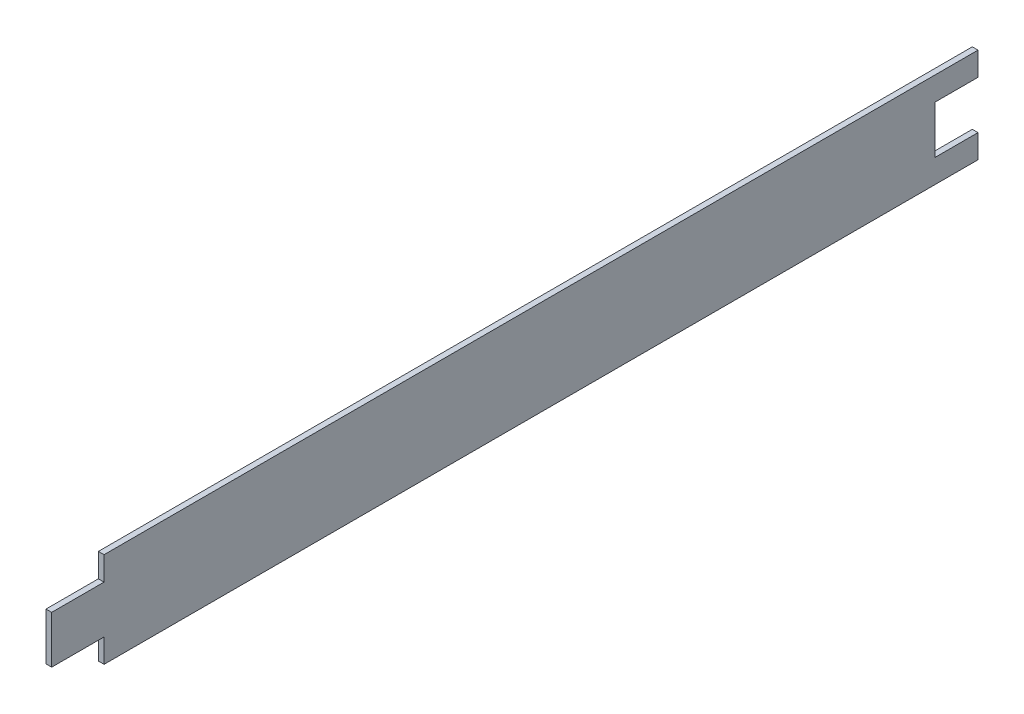
ISO-10303-21;
HEADER;
FILE_DESCRIPTION(('STEP AP214'),'2;1');
FILE_NAME('part.step','',(''),(''),'','','');
FILE_SCHEMA(('AUTOMOTIVE_DESIGN { 1 0 10303 214 1 1 1 1 }'));
ENDSEC;
DATA;
#1=APPLICATION_CONTEXT('core data for automotive mechanical design processes');
#2=APPLICATION_PROTOCOL_DEFINITION('international standard','automotive_design',2000,#1);
#3=PRODUCT_CONTEXT('',#1,'mechanical');
#4=PRODUCT('Part','Part','',(#3));
#5=PRODUCT_RELATED_PRODUCT_CATEGORY('part','',(#4));
#6=PRODUCT_DEFINITION_FORMATION('','',#4);
#7=PRODUCT_DEFINITION_CONTEXT('part definition',#1,'design');
#8=PRODUCT_DEFINITION('design','',#6,#7);
#9=PRODUCT_DEFINITION_SHAPE('','',#8);
#10=(LENGTH_UNIT() NAMED_UNIT(*) SI_UNIT(.MILLI.,.METRE.));
#11=(NAMED_UNIT(*) PLANE_ANGLE_UNIT() SI_UNIT($,.RADIAN.));
#12=(NAMED_UNIT(*) SI_UNIT($,.STERADIAN.) SOLID_ANGLE_UNIT());
#13=UNCERTAINTY_MEASURE_WITH_UNIT(LENGTH_MEASURE(1.E-05),#10,'distance_accuracy_value','');
#14=(GEOMETRIC_REPRESENTATION_CONTEXT(3) GLOBAL_UNCERTAINTY_ASSIGNED_CONTEXT((#13)) GLOBAL_UNIT_ASSIGNED_CONTEXT((#10,
#11,#12)) REPRESENTATION_CONTEXT('',''));
#15=CARTESIAN_POINT('',(0.,0.,0.));
#16=DIRECTION('',(0.,0.,1.));
#17=DIRECTION('',(1.,0.,0.));
#18=AXIS2_PLACEMENT_3D('',#15,#16,#17);
#19=CARTESIAN_POINT('',(3.,12.5,0.));
#20=DIRECTION('',(0.,1.,0.));
#21=DIRECTION('',(0.,0.,1.));
#22=AXIS2_PLACEMENT_3D('',#19,#20,#21);
#23=PLANE('',#22);
#24=DIRECTION('',(0.,0.,-1.));
#25=VECTOR('',#24,1.);
#26=CARTESIAN_POINT('',(0.,12.5,0.));
#27=LINE('',#26,#25);
#28=CARTESIAN_POINT('',(0.,12.5,257.569429710444));
#29=VERTEX_POINT('',#28);
#30=CARTESIAN_POINT('',(0.,12.5,230.));
#31=VERTEX_POINT('',#30);
#32=EDGE_CURVE('E155',#29,#31,#27,.T.);
#33=ORIENTED_EDGE('',*,*,#32,.F.);
#34=DIRECTION('',(-1.,0.,0.));
#35=VECTOR('',#34,1.);
#36=CARTESIAN_POINT('',(3.,12.5,257.569429710444));
#37=LINE('',#36,#35);
#38=CARTESIAN_POINT('',(3.,12.5,257.569429710444));
#39=VERTEX_POINT('',#38);
#40=EDGE_CURVE('E11',#39,#29,#37,.T.);
#41=ORIENTED_EDGE('',*,*,#40,.F.);
#42=DIRECTION('',(0.,0.,-1.));
#43=VECTOR('',#42,1.);
#44=CARTESIAN_POINT('',(3.,12.5,0.));
#45=LINE('',#44,#43);
#46=CARTESIAN_POINT('',(3.,12.5,230.));
#47=VERTEX_POINT('',#46);
#48=EDGE_CURVE('E215',#39,#47,#45,.T.);
#49=ORIENTED_EDGE('',*,*,#48,.T.);
#50=DIRECTION('',(-1.,0.,0.));
#51=VECTOR('',#50,1.);
#52=CARTESIAN_POINT('',(3.,12.5,230.));
#53=LINE('',#52,#51);
#54=EDGE_CURVE('E97',#47,#31,#53,.T.);
#55=ORIENTED_EDGE('',*,*,#54,.T.);
#56=EDGE_LOOP('',(#33,#41,#49,#55));
#57=FACE_BOUND('',#56,.T.);
#58=ADVANCED_FACE('F35',(#57),#23,.T.);
#59=CARTESIAN_POINT('',(3.,0.,257.569429710444));
#60=DIRECTION('',(0.,0.,1.));
#61=DIRECTION('',(1.,0.,0.));
#62=AXIS2_PLACEMENT_3D('',#59,#60,#61);
#63=PLANE('',#62);
#64=DIRECTION('',(0.,1.,0.));
#65=VECTOR('',#64,1.);
#66=CARTESIAN_POINT('',(0.,0.,257.569429710444));
#67=LINE('',#66,#65);
#68=CARTESIAN_POINT('',(0.,-12.5,257.569429710444));
#69=VERTEX_POINT('',#68);
#70=EDGE_CURVE('E158',#69,#29,#67,.T.);
#71=ORIENTED_EDGE('',*,*,#70,.F.);
#72=DIRECTION('',(-1.,0.,0.));
#73=VECTOR('',#72,1.);
#74=CARTESIAN_POINT('',(3.,-12.5,257.569429710444));
#75=LINE('',#74,#73);
#76=CARTESIAN_POINT('',(3.,-12.5,257.569429710444));
#77=VERTEX_POINT('',#76);
#78=EDGE_CURVE('E43',#77,#69,#75,.T.);
#79=ORIENTED_EDGE('',*,*,#78,.F.);
#80=DIRECTION('',(0.,1.,0.));
#81=VECTOR('',#80,1.);
#82=CARTESIAN_POINT('',(3.,0.,257.569429710444));
#83=LINE('',#82,#81);
#84=EDGE_CURVE('E214',#77,#39,#83,.T.);
#85=ORIENTED_EDGE('',*,*,#84,.T.);
#86=ORIENTED_EDGE('',*,*,#40,.T.);
#87=EDGE_LOOP('',(#71,#79,#85,#86));
#88=FACE_BOUND('',#87,.T.);
#89=ADVANCED_FACE('F213',(#88),#63,.T.);
#90=CARTESIAN_POINT('',(3.,-12.5,0.));
#91=DIRECTION('',(0.,1.,0.));
#92=DIRECTION('',(0.,0.,1.));
#93=AXIS2_PLACEMENT_3D('',#90,#91,#92);
#94=PLANE('',#93);
#95=DIRECTION('',(0.,0.,-1.));
#96=VECTOR('',#95,1.);
#97=CARTESIAN_POINT('',(0.,-12.5,0.));
#98=LINE('',#97,#96);
#99=CARTESIAN_POINT('',(0.,-12.5,230.));
#100=VERTEX_POINT('',#99);
#101=EDGE_CURVE('E161',#69,#100,#98,.T.);
#102=ORIENTED_EDGE('',*,*,#101,.T.);
#103=DIRECTION('',(-1.,0.,0.));
#104=VECTOR('',#103,1.);
#105=CARTESIAN_POINT('',(3.,-12.5,230.));
#106=LINE('',#105,#104);
#107=CARTESIAN_POINT('',(3.,-12.5,230.));
#108=VERTEX_POINT('',#107);
#109=EDGE_CURVE('E197',#108,#100,#106,.T.);
#110=ORIENTED_EDGE('',*,*,#109,.F.);
#111=DIRECTION('',(0.,0.,-1.));
#112=VECTOR('',#111,1.);
#113=CARTESIAN_POINT('',(3.,-12.5,0.));
#114=LINE('',#113,#112);
#115=EDGE_CURVE('E204',#77,#108,#114,.T.);
#116=ORIENTED_EDGE('',*,*,#115,.F.);
#117=ORIENTED_EDGE('',*,*,#78,.T.);
#118=EDGE_LOOP('',(#102,#110,#116,#117));
#119=FACE_BOUND('',#118,.T.);
#120=ADVANCED_FACE('F202',(#119),#94,.F.);
#121=CARTESIAN_POINT('',(3.,0.,230.));
#122=DIRECTION('',(0.,0.,-1.));
#123=DIRECTION('',(-1.,0.,0.));
#124=AXIS2_PLACEMENT_3D('',#121,#122,#123);
#125=PLANE('',#124);
#126=DIRECTION('',(0.,-1.,0.));
#127=VECTOR('',#126,1.);
#128=CARTESIAN_POINT('',(0.,0.,230.));
#129=LINE('',#128,#127);
#130=CARTESIAN_POINT('',(0.,-25.,230.));
#131=VERTEX_POINT('',#130);
#132=EDGE_CURVE('E163',#100,#131,#129,.T.);
#133=ORIENTED_EDGE('',*,*,#132,.T.);
#134=DIRECTION('',(-1.,0.,0.));
#135=VECTOR('',#134,1.);
#136=CARTESIAN_POINT('',(3.,-25.,230.));
#137=LINE('',#136,#135);
#138=CARTESIAN_POINT('',(3.,-25.,230.));
#139=VERTEX_POINT('',#138);
#140=EDGE_CURVE('E194',#139,#131,#137,.T.);
#141=ORIENTED_EDGE('',*,*,#140,.F.);
#142=DIRECTION('',(0.,-1.,0.));
#143=VECTOR('',#142,1.);
#144=CARTESIAN_POINT('',(3.,0.,230.));
#145=LINE('',#144,#143);
#146=EDGE_CURVE('E151',#108,#139,#145,.T.);
#147=ORIENTED_EDGE('',*,*,#146,.F.);
#148=ORIENTED_EDGE('',*,*,#109,.T.);
#149=EDGE_LOOP('',(#133,#141,#147,#148));
#150=FACE_BOUND('',#149,.T.);
#151=ADVANCED_FACE('F255',(#150),#125,.F.);
#152=CARTESIAN_POINT('',(3.,-25.,0.));
#153=DIRECTION('',(0.,1.,0.));
#154=DIRECTION('',(0.,0.,1.));
#155=AXIS2_PLACEMENT_3D('',#152,#153,#154);
#156=PLANE('',#155);
#157=DIRECTION('',(0.,0.,-1.));
#158=VECTOR('',#157,1.);
#159=CARTESIAN_POINT('',(0.,-25.,0.));
#160=LINE('',#159,#158);
#161=CARTESIAN_POINT('',(0.,-25.,-230.));
#162=VERTEX_POINT('',#161);
#163=EDGE_CURVE('E165',#131,#162,#160,.T.);
#164=ORIENTED_EDGE('',*,*,#163,.T.);
#165=DIRECTION('',(-1.,0.,0.));
#166=VECTOR('',#165,1.);
#167=CARTESIAN_POINT('',(3.,-25.,-230.));
#168=LINE('',#167,#166);
#169=CARTESIAN_POINT('',(3.,-25.,-230.));
#170=VERTEX_POINT('',#169);
#171=EDGE_CURVE('E192',#170,#162,#168,.T.);
#172=ORIENTED_EDGE('',*,*,#171,.F.);
#173=DIRECTION('',(0.,0.,-1.));
#174=VECTOR('',#173,1.);
#175=CARTESIAN_POINT('',(3.,-25.,0.));
#176=LINE('',#175,#174);
#177=EDGE_CURVE('E220',#139,#170,#176,.T.);
#178=ORIENTED_EDGE('',*,*,#177,.F.);
#179=ORIENTED_EDGE('',*,*,#140,.T.);
#180=EDGE_LOOP('',(#164,#172,#178,#179));
#181=FACE_BOUND('',#180,.T.);
#182=ADVANCED_FACE('F258',(#181),#156,.F.);
#183=CARTESIAN_POINT('',(3.,0.,-230.));
#184=DIRECTION('',(0.,0.,-1.));
#185=DIRECTION('',(-1.,0.,0.));
#186=AXIS2_PLACEMENT_3D('',#183,#184,#185);
#187=PLANE('',#186);
#188=DIRECTION('',(0.,-1.,0.));
#189=VECTOR('',#188,1.);
#190=CARTESIAN_POINT('',(0.,0.,-230.));
#191=LINE('',#190,#189);
#192=CARTESIAN_POINT('',(0.,-12.6,-230.));
#193=VERTEX_POINT('',#192);
#194=EDGE_CURVE('E169',#193,#162,#191,.T.);
#195=ORIENTED_EDGE('',*,*,#194,.F.);
#196=DIRECTION('',(-1.,0.,0.));
#197=VECTOR('',#196,1.);
#198=CARTESIAN_POINT('',(3.,-12.6,-230.));
#199=LINE('',#198,#197);
#200=CARTESIAN_POINT('',(3.,-12.6,-230.));
#201=VERTEX_POINT('',#200);
#202=EDGE_CURVE('E190',#201,#193,#199,.T.);
#203=ORIENTED_EDGE('',*,*,#202,.F.);
#204=DIRECTION('',(0.,-1.,0.));
#205=VECTOR('',#204,1.);
#206=CARTESIAN_POINT('',(3.,0.,-230.));
#207=LINE('',#206,#205);
#208=EDGE_CURVE('E147',#201,#170,#207,.T.);
#209=ORIENTED_EDGE('',*,*,#208,.T.);
#210=ORIENTED_EDGE('',*,*,#171,.T.);
#211=EDGE_LOOP('',(#195,#203,#209,#210));
#212=FACE_BOUND('',#211,.T.);
#213=ADVANCED_FACE('F246',(#212),#187,.T.);
#214=CARTESIAN_POINT('',(3.,-12.6,0.));
#215=DIRECTION('',(0.,1.,0.));
#216=DIRECTION('',(0.,0.,1.));
#217=AXIS2_PLACEMENT_3D('',#214,#215,#216);
#218=PLANE('',#217);
#219=DIRECTION('',(0.,0.,-1.));
#220=VECTOR('',#219,1.);
#221=CARTESIAN_POINT('',(0.,-12.6,0.));
#222=LINE('',#221,#220);
#223=CARTESIAN_POINT('',(0.,-12.6,-207.351490584509));
#224=VERTEX_POINT('',#223);
#225=EDGE_CURVE('E172',#224,#193,#222,.T.);
#226=ORIENTED_EDGE('',*,*,#225,.F.);
#227=DIRECTION('',(-1.,0.,0.));
#228=VECTOR('',#227,1.);
#229=CARTESIAN_POINT('',(3.,-12.6,-207.351490584509));
#230=LINE('',#229,#228);
#231=CARTESIAN_POINT('',(3.,-12.6,-207.351490584509));
#232=VERTEX_POINT('',#231);
#233=EDGE_CURVE('E188',#232,#224,#230,.T.);
#234=ORIENTED_EDGE('',*,*,#233,.F.);
#235=DIRECTION('',(0.,0.,-1.));
#236=VECTOR('',#235,1.);
#237=CARTESIAN_POINT('',(3.,-12.6,0.));
#238=LINE('',#237,#236);
#239=EDGE_CURVE('E223',#232,#201,#238,.T.);
#240=ORIENTED_EDGE('',*,*,#239,.T.);
#241=ORIENTED_EDGE('',*,*,#202,.T.);
#242=EDGE_LOOP('',(#226,#234,#240,#241));
#243=FACE_BOUND('',#242,.T.);
#244=ADVANCED_FACE('F234',(#243),#218,.T.);
#245=CARTESIAN_POINT('',(3.,0.,-207.351490584509));
#246=DIRECTION('',(0.,0.,-1.));
#247=DIRECTION('',(-1.,0.,0.));
#248=AXIS2_PLACEMENT_3D('',#245,#246,#247);
#249=PLANE('',#248);
#250=DIRECTION('',(0.,-1.,0.));
#251=VECTOR('',#250,1.);
#252=CARTESIAN_POINT('',(0.,0.,-207.351490584509));
#253=LINE('',#252,#251);
#254=CARTESIAN_POINT('',(0.,12.6,-207.351490584509));
#255=VERTEX_POINT('',#254);
#256=EDGE_CURVE('E175',#255,#224,#253,.T.);
#257=ORIENTED_EDGE('',*,*,#256,.F.);
#258=DIRECTION('',(-1.,0.,0.));
#259=VECTOR('',#258,1.);
#260=CARTESIAN_POINT('',(3.,12.6,-207.351490584509));
#261=LINE('',#260,#259);
#262=CARTESIAN_POINT('',(3.,12.6,-207.351490584509));
#263=VERTEX_POINT('',#262);
#264=EDGE_CURVE('E186',#263,#255,#261,.T.);
#265=ORIENTED_EDGE('',*,*,#264,.F.);
#266=DIRECTION('',(0.,-1.,0.));
#267=VECTOR('',#266,1.);
#268=CARTESIAN_POINT('',(3.,0.,-207.351490584509));
#269=LINE('',#268,#267);
#270=EDGE_CURVE('E225',#263,#232,#269,.T.);
#271=ORIENTED_EDGE('',*,*,#270,.T.);
#272=ORIENTED_EDGE('',*,*,#233,.T.);
#273=EDGE_LOOP('',(#257,#265,#271,#272));
#274=FACE_BOUND('',#273,.T.);
#275=ADVANCED_FACE('F229',(#274),#249,.T.);
#276=CARTESIAN_POINT('',(3.,12.6,0.));
#277=DIRECTION('',(0.,1.,0.));
#278=DIRECTION('',(0.,0.,1.));
#279=AXIS2_PLACEMENT_3D('',#276,#277,#278);
#280=PLANE('',#279);
#281=DIRECTION('',(0.,0.,-1.));
#282=VECTOR('',#281,1.);
#283=CARTESIAN_POINT('',(0.,12.6,0.));
#284=LINE('',#283,#282);
#285=CARTESIAN_POINT('',(0.,12.6,-230.));
#286=VERTEX_POINT('',#285);
#287=EDGE_CURVE('E178',#255,#286,#284,.T.);
#288=ORIENTED_EDGE('',*,*,#287,.T.);
#289=DIRECTION('',(-1.,0.,0.));
#290=VECTOR('',#289,1.);
#291=CARTESIAN_POINT('',(3.,12.6,-230.));
#292=LINE('',#291,#290);
#293=CARTESIAN_POINT('',(3.,12.6,-230.));
#294=VERTEX_POINT('',#293);
#295=EDGE_CURVE('E138',#294,#286,#292,.T.);
#296=ORIENTED_EDGE('',*,*,#295,.F.);
#297=DIRECTION('',(0.,0.,-1.));
#298=VECTOR('',#297,1.);
#299=CARTESIAN_POINT('',(3.,12.6,0.));
#300=LINE('',#299,#298);
#301=EDGE_CURVE('E144',#263,#294,#300,.T.);
#302=ORIENTED_EDGE('',*,*,#301,.F.);
#303=ORIENTED_EDGE('',*,*,#264,.T.);
#304=EDGE_LOOP('',(#288,#296,#302,#303));
#305=FACE_BOUND('',#304,.T.);
#306=ADVANCED_FACE('F238',(#305),#280,.F.);
#307=CARTESIAN_POINT('',(0.,25.,-230.));
#308=VERTEX_POINT('',#307);
#309=EDGE_CURVE('E133',#308,#286,#191,.T.);
#310=ORIENTED_EDGE('',*,*,#309,.F.);
#311=DIRECTION('',(-1.,0.,0.));
#312=VECTOR('',#311,1.);
#313=CARTESIAN_POINT('',(3.,25.,-230.));
#314=LINE('',#313,#312);
#315=CARTESIAN_POINT('',(3.,25.,-230.));
#316=VERTEX_POINT('',#315);
#317=EDGE_CURVE('E128',#316,#308,#314,.T.);
#318=ORIENTED_EDGE('',*,*,#317,.F.);
#319=EDGE_CURVE('E131',#316,#294,#207,.T.);
#320=ORIENTED_EDGE('',*,*,#319,.T.);
#321=ORIENTED_EDGE('',*,*,#295,.T.);
#322=EDGE_LOOP('',(#310,#318,#320,#321));
#323=FACE_BOUND('',#322,.T.);
#324=ADVANCED_FACE('F130',(#323),#187,.T.);
#325=CARTESIAN_POINT('',(3.,25.,0.));
#326=DIRECTION('',(0.,1.,0.));
#327=DIRECTION('',(0.,0.,1.));
#328=AXIS2_PLACEMENT_3D('',#325,#326,#327);
#329=PLANE('',#328);
#330=DIRECTION('',(0.,0.,-1.));
#331=VECTOR('',#330,1.);
#332=CARTESIAN_POINT('',(0.,25.,0.));
#333=LINE('',#332,#331);
#334=CARTESIAN_POINT('',(0.,25.,230.));
#335=VERTEX_POINT('',#334);
#336=EDGE_CURVE('E181',#335,#308,#333,.T.);
#337=ORIENTED_EDGE('',*,*,#336,.F.);
#338=DIRECTION('',(-1.,0.,0.));
#339=VECTOR('',#338,1.);
#340=CARTESIAN_POINT('',(3.,25.,230.));
#341=LINE('',#340,#339);
#342=CARTESIAN_POINT('',(3.,25.,230.));
#343=VERTEX_POINT('',#342);
#344=EDGE_CURVE('E90',#343,#335,#341,.T.);
#345=ORIENTED_EDGE('',*,*,#344,.F.);
#346=DIRECTION('',(0.,0.,-1.));
#347=VECTOR('',#346,1.);
#348=CARTESIAN_POINT('',(3.,25.,0.));
#349=LINE('',#348,#347);
#350=EDGE_CURVE('E141',#343,#316,#349,.T.);
#351=ORIENTED_EDGE('',*,*,#350,.T.);
#352=ORIENTED_EDGE('',*,*,#317,.T.);
#353=EDGE_LOOP('',(#337,#345,#351,#352));
#354=FACE_BOUND('',#353,.T.);
#355=ADVANCED_FACE('F148',(#354),#329,.T.);
#356=EDGE_CURVE('E166',#335,#31,#129,.T.);
#357=ORIENTED_EDGE('',*,*,#356,.T.);
#358=ORIENTED_EDGE('',*,*,#54,.F.);
#359=EDGE_CURVE('E51',#343,#47,#145,.T.);
#360=ORIENTED_EDGE('',*,*,#359,.F.);
#361=ORIENTED_EDGE('',*,*,#344,.T.);
#362=EDGE_LOOP('',(#357,#358,#360,#361));
#363=FACE_BOUND('',#362,.T.);
#364=ADVANCED_FACE('F272',(#363),#125,.F.);
#365=CARTESIAN_POINT('',(3.,0.,0.));
#366=DIRECTION('',(1.,0.,0.));
#367=DIRECTION('',(0.,0.,-1.));
#368=AXIS2_PLACEMENT_3D('',#365,#366,#367);
#369=PLANE('',#368);
#370=ORIENTED_EDGE('',*,*,#48,.F.);
#371=ORIENTED_EDGE('',*,*,#84,.F.);
#372=ORIENTED_EDGE('',*,*,#115,.T.);
#373=ORIENTED_EDGE('',*,*,#146,.T.);
#374=ORIENTED_EDGE('',*,*,#177,.T.);
#375=ORIENTED_EDGE('',*,*,#208,.F.);
#376=ORIENTED_EDGE('',*,*,#239,.F.);
#377=ORIENTED_EDGE('',*,*,#270,.F.);
#378=ORIENTED_EDGE('',*,*,#301,.T.);
#379=ORIENTED_EDGE('',*,*,#319,.F.);
#380=ORIENTED_EDGE('',*,*,#350,.F.);
#381=ORIENTED_EDGE('',*,*,#359,.T.);
#382=EDGE_LOOP('',(#370,#371,#372,#373,#374,#375,#376,#377,#378,#379,#380,#381));
#383=FACE_BOUND('',#382,.T.);
#384=ADVANCED_FACE('F140',(#383),#369,.T.);
#385=CARTESIAN_POINT('',(0.,0.,0.));
#386=DIRECTION('',(1.,0.,0.));
#387=DIRECTION('',(0.,0.,-1.));
#388=AXIS2_PLACEMENT_3D('',#385,#386,#387);
#389=PLANE('',#388);
#390=ORIENTED_EDGE('',*,*,#32,.T.);
#391=ORIENTED_EDGE('',*,*,#356,.F.);
#392=ORIENTED_EDGE('',*,*,#336,.T.);
#393=ORIENTED_EDGE('',*,*,#309,.T.);
#394=ORIENTED_EDGE('',*,*,#287,.F.);
#395=ORIENTED_EDGE('',*,*,#256,.T.);
#396=ORIENTED_EDGE('',*,*,#225,.T.);
#397=ORIENTED_EDGE('',*,*,#194,.T.);
#398=ORIENTED_EDGE('',*,*,#163,.F.);
#399=ORIENTED_EDGE('',*,*,#132,.F.);
#400=ORIENTED_EDGE('',*,*,#101,.F.);
#401=ORIENTED_EDGE('',*,*,#70,.T.);
#402=EDGE_LOOP('',(#390,#391,#392,#393,#394,#395,#396,#397,#398,#399,#400,#401));
#403=FACE_BOUND('',#402,.T.);
#404=ADVANCED_FACE('F211',(#403),#389,.F.);
#405=CLOSED_SHELL('',(#58,#89,#120,#151,#182,#213,#244,#275,#306,#324,#355,#364,#384,#404));
#406=MANIFOLD_SOLID_BREP('B2',#405);
#407=ADVANCED_BREP_SHAPE_REPRESENTATION('',(#18,#406),#14);
#408=SHAPE_DEFINITION_REPRESENTATION(#9,#407);
ENDSEC;
END-ISO-10303-21;
